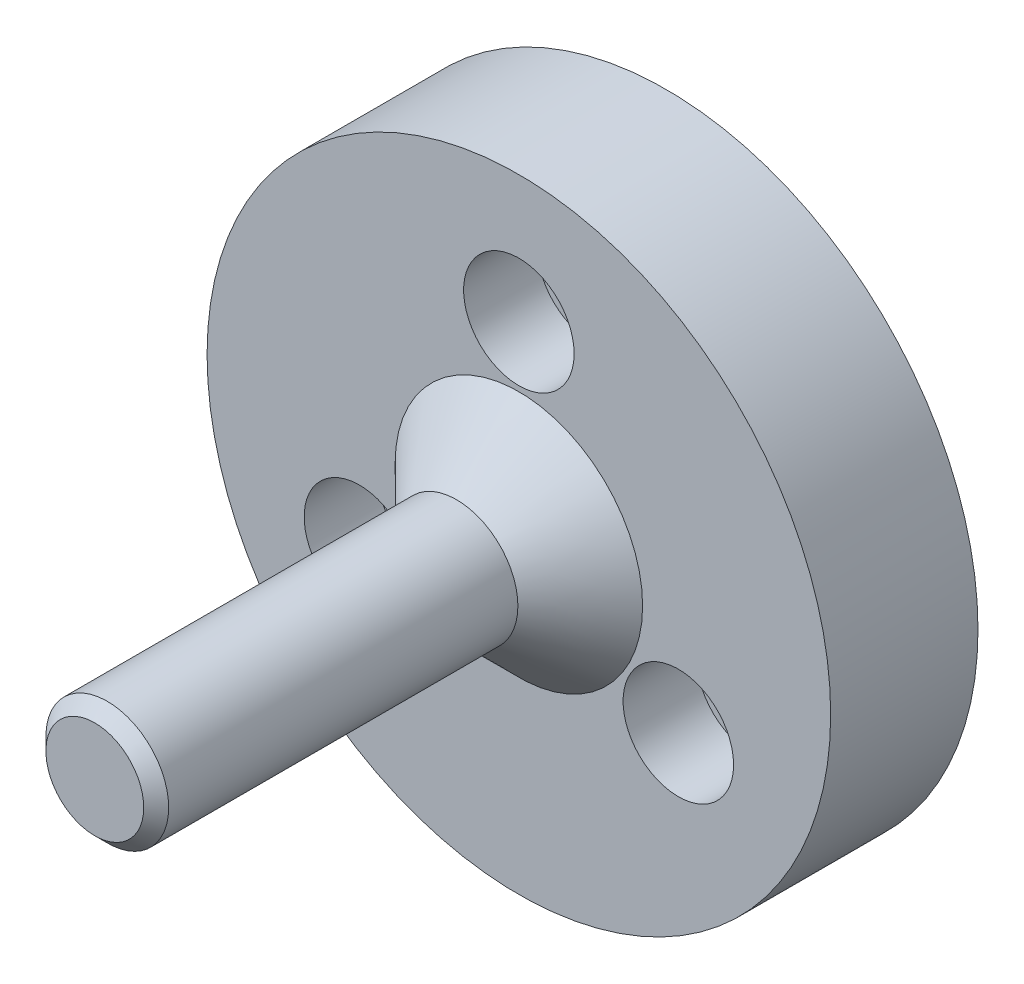
ISO-10303-21;
HEADER;
FILE_DESCRIPTION(('STEP AP214'),'2;1');
FILE_NAME('part.step','',(''),(''),'','','');
FILE_SCHEMA(('AUTOMOTIVE_DESIGN { 1 0 10303 214 1 1 1 1 }'));
ENDSEC;
DATA;
#1=APPLICATION_CONTEXT('core data for automotive mechanical design processes');
#2=APPLICATION_PROTOCOL_DEFINITION('international standard','automotive_design',2000,#1);
#3=PRODUCT_CONTEXT('',#1,'mechanical');
#4=PRODUCT('Part','Part','',(#3));
#5=PRODUCT_RELATED_PRODUCT_CATEGORY('part','',(#4));
#6=PRODUCT_DEFINITION_FORMATION('','',#4);
#7=PRODUCT_DEFINITION_CONTEXT('part definition',#1,'design');
#8=PRODUCT_DEFINITION('design','',#6,#7);
#9=PRODUCT_DEFINITION_SHAPE('','',#8);
#10=(LENGTH_UNIT() NAMED_UNIT(*) SI_UNIT(.MILLI.,.METRE.));
#11=(NAMED_UNIT(*) PLANE_ANGLE_UNIT() SI_UNIT($,.RADIAN.));
#12=(NAMED_UNIT(*) SI_UNIT($,.STERADIAN.) SOLID_ANGLE_UNIT());
#13=UNCERTAINTY_MEASURE_WITH_UNIT(LENGTH_MEASURE(1.E-05),#10,'distance_accuracy_value','');
#14=(GEOMETRIC_REPRESENTATION_CONTEXT(3) GLOBAL_UNCERTAINTY_ASSIGNED_CONTEXT((#13)) GLOBAL_UNIT_ASSIGNED_CONTEXT((#10,
#11,#12)) REPRESENTATION_CONTEXT('',''));
#15=CARTESIAN_POINT('',(0.,0.,0.));
#16=DIRECTION('',(0.,0.,1.));
#17=DIRECTION('',(1.,0.,0.));
#18=AXIS2_PLACEMENT_3D('',#15,#16,#17);
#19=CARTESIAN_POINT('',(6.49519052838377,-3.74999999999972,0.));
#20=DIRECTION('',(0.,0.,1.));
#21=DIRECTION('',(1.,0.,0.));
#22=AXIS2_PLACEMENT_3D('',#19,#20,#21);
#23=CYLINDRICAL_SURFACE('',#22,1.45);
#24=CARTESIAN_POINT('',(6.49519052838377,-3.74999999999972,2.54));
#25=DIRECTION('',(0.,0.,-1.));
#26=DIRECTION('',(-1.,0.,0.));
#27=AXIS2_PLACEMENT_3D('',#24,#25,#26);
#28=CIRCLE('',#27,1.45);
#29=CARTESIAN_POINT('',(5.04873569964322,-3.85133325423132,2.54));
#30=VERTEX_POINT('',#29);
#31=CARTESIAN_POINT('',(5.85972028642604,-2.44666674576802,2.54));
#32=VERTEX_POINT('',#31);
#33=EDGE_CURVE('E140',#30,#32,#28,.T.);
#34=ORIENTED_EDGE('',*,*,#33,.T.);
#35=DIRECTION('',(0.,0.,1.));
#36=VECTOR('',#35,1.);
#37=CARTESIAN_POINT('',(5.85972028642604,-2.44666674576802,3.));
#38=LINE('',#37,#36);
#39=CARTESIAN_POINT('',(5.85972028642604,-2.44666674576802,0.));
#40=VERTEX_POINT('',#39);
#41=EDGE_CURVE('E218',#40,#32,#38,.T.);
#42=ORIENTED_EDGE('',*,*,#41,.F.);
#43=CARTESIAN_POINT('',(6.49519052838377,-3.74999999999972,0.));
#44=DIRECTION('',(0.,0.,1.));
#45=DIRECTION('',(1.,0.,0.));
#46=AXIS2_PLACEMENT_3D('',#43,#44,#45);
#47=CIRCLE('',#46,1.45);
#48=CARTESIAN_POINT('',(5.04873569964323,-3.85133325423132,0.));
#49=VERTEX_POINT('',#48);
#50=EDGE_CURVE('E103',#49,#40,#47,.T.);
#51=ORIENTED_EDGE('',*,*,#50,.F.);
#52=DIRECTION('',(0.,0.,1.));
#53=VECTOR('',#52,1.);
#54=CARTESIAN_POINT('',(5.04873569964323,-3.85133325423132,3.));
#55=LINE('',#54,#53);
#56=EDGE_CURVE('E57',#30,#49,#55,.F.);
#57=ORIENTED_EDGE('',*,*,#56,.F.);
#58=EDGE_LOOP('',(#34,#42,#51,#57));
#59=FACE_BOUND('',#58,.T.);
#60=CARTESIAN_POINT('',(6.49519052838377,-3.74999999999972,3.));
#61=DIRECTION('',(0.,0.,1.));
#62=DIRECTION('',(1.,0.,0.));
#63=AXIS2_PLACEMENT_3D('',#60,#61,#62);
#64=CIRCLE('',#63,1.45);
#65=CARTESIAN_POINT('',(7.94519052838377,-3.74999999999972,3.));
#66=VERTEX_POINT('',#65);
#67=EDGE_CURVE('E153',#66,#66,#64,.F.);
#68=ORIENTED_EDGE('',*,*,#67,.F.);
#69=EDGE_LOOP('',(#68));
#70=FACE_BOUND('',#69,.T.);
#71=ADVANCED_FACE('F34',(#59,#70),#23,.F.);
#72=CARTESIAN_POINT('',(-6.49519052838281,-3.75000000000028,0.));
#73=DIRECTION('',(0.,0.,1.));
#74=DIRECTION('',(1.,0.,0.));
#75=AXIS2_PLACEMENT_3D('',#72,#73,#74);
#76=CYLINDRICAL_SURFACE('',#75,1.45);
#77=CARTESIAN_POINT('',(-6.49519052838281,-3.75000000000028,2.54));
#78=DIRECTION('',(0.,0.,-1.));
#79=DIRECTION('',(-1.,0.,0.));
#80=AXIS2_PLACEMENT_3D('',#77,#78,#79);
#81=CIRCLE('',#80,1.45);
#82=CARTESIAN_POINT('',(-5.859720286426,-2.44666674576814,2.54));
#83=VERTEX_POINT('',#82);
#84=CARTESIAN_POINT('',(-5.04873569964231,-3.85133325423252,2.54));
#85=VERTEX_POINT('',#84);
#86=EDGE_CURVE('E142',#83,#85,#81,.T.);
#87=ORIENTED_EDGE('',*,*,#86,.T.);
#88=DIRECTION('',(0.,0.,1.));
#89=VECTOR('',#88,1.);
#90=CARTESIAN_POINT('',(-5.04873569964231,-3.85133325423252,3.));
#91=LINE('',#90,#89);
#92=CARTESIAN_POINT('',(-5.04873569964231,-3.85133325423252,0.));
#93=VERTEX_POINT('',#92);
#94=EDGE_CURVE('E89',#93,#85,#91,.T.);
#95=ORIENTED_EDGE('',*,*,#94,.F.);
#96=CARTESIAN_POINT('',(-6.49519052838281,-3.75000000000028,0.));
#97=DIRECTION('',(0.,0.,1.));
#98=DIRECTION('',(1.,0.,0.));
#99=AXIS2_PLACEMENT_3D('',#96,#97,#98);
#100=CIRCLE('',#99,1.45);
#101=CARTESIAN_POINT('',(-5.859720286426,-2.44666674576814,0.));
#102=VERTEX_POINT('',#101);
#103=EDGE_CURVE('E85',#102,#93,#100,.T.);
#104=ORIENTED_EDGE('',*,*,#103,.F.);
#105=DIRECTION('',(0.,0.,1.));
#106=VECTOR('',#105,1.);
#107=CARTESIAN_POINT('',(-5.859720286426,-2.44666674576814,3.));
#108=LINE('',#107,#106);
#109=EDGE_CURVE('E49',#83,#102,#108,.F.);
#110=ORIENTED_EDGE('',*,*,#109,.F.);
#111=EDGE_LOOP('',(#87,#95,#104,#110));
#112=FACE_BOUND('',#111,.T.);
#113=CARTESIAN_POINT('',(-6.49519052838281,-3.75000000000028,3.));
#114=DIRECTION('',(0.,0.,1.));
#115=DIRECTION('',(1.,0.,0.));
#116=AXIS2_PLACEMENT_3D('',#113,#114,#115);
#117=CIRCLE('',#116,1.45);
#118=CARTESIAN_POINT('',(-5.04519052838281,-3.75000000000028,3.));
#119=VERTEX_POINT('',#118);
#120=EDGE_CURVE('E148',#119,#119,#117,.F.);
#121=ORIENTED_EDGE('',*,*,#120,.F.);
#122=EDGE_LOOP('',(#121));
#123=FACE_BOUND('',#122,.T.);
#124=ADVANCED_FACE('F86',(#112,#123),#76,.F.);
#125=CARTESIAN_POINT('',(0.,7.5,0.));
#126=DIRECTION('',(0.,0.,1.));
#127=DIRECTION('',(1.,0.,0.));
#128=AXIS2_PLACEMENT_3D('',#125,#126,#127);
#129=CYLINDRICAL_SURFACE('',#128,1.45);
#130=CARTESIAN_POINT('',(0.,7.5,2.54));
#131=DIRECTION('',(0.,0.,-1.));
#132=DIRECTION('',(-1.,0.,0.));
#133=AXIS2_PLACEMENT_3D('',#130,#131,#132);
#134=CIRCLE('',#133,1.45);
#135=CARTESIAN_POINT('',(0.810984586783252,6.298,2.54));
#136=VERTEX_POINT('',#135);
#137=CARTESIAN_POINT('',(-0.810984586783252,6.298,2.54));
#138=VERTEX_POINT('',#137);
#139=EDGE_CURVE('E137',#136,#138,#134,.T.);
#140=ORIENTED_EDGE('',*,*,#139,.T.);
#141=DIRECTION('',(0.,0.,1.));
#142=VECTOR('',#141,1.);
#143=CARTESIAN_POINT('',(-0.810984586783251,6.298,3.));
#144=LINE('',#143,#142);
#145=CARTESIAN_POINT('',(-0.810984586783251,6.298,0.));
#146=VERTEX_POINT('',#145);
#147=EDGE_CURVE('E115',#146,#138,#144,.T.);
#148=ORIENTED_EDGE('',*,*,#147,.F.);
#149=CARTESIAN_POINT('',(0.,7.5,0.));
#150=DIRECTION('',(0.,0.,1.));
#151=DIRECTION('',(1.,0.,0.));
#152=AXIS2_PLACEMENT_3D('',#149,#150,#151);
#153=CIRCLE('',#152,1.45);
#154=CARTESIAN_POINT('',(0.810984586783251,6.298,0.));
#155=VERTEX_POINT('',#154);
#156=EDGE_CURVE('E109',#155,#146,#153,.T.);
#157=ORIENTED_EDGE('',*,*,#156,.F.);
#158=DIRECTION('',(0.,0.,1.));
#159=VECTOR('',#158,1.);
#160=CARTESIAN_POINT('',(0.810984586783251,6.298,3.));
#161=LINE('',#160,#159);
#162=EDGE_CURVE('E111',#136,#155,#161,.F.);
#163=ORIENTED_EDGE('',*,*,#162,.F.);
#164=EDGE_LOOP('',(#140,#148,#157,#163));
#165=FACE_BOUND('',#164,.T.);
#166=CARTESIAN_POINT('',(0.,7.5,3.));
#167=DIRECTION('',(0.,0.,1.));
#168=DIRECTION('',(1.,0.,0.));
#169=AXIS2_PLACEMENT_3D('',#166,#167,#168);
#170=CIRCLE('',#169,1.45);
#171=CARTESIAN_POINT('',(1.45,7.5,3.));
#172=VERTEX_POINT('',#171);
#173=EDGE_CURVE('E94',#172,#172,#170,.F.);
#174=ORIENTED_EDGE('',*,*,#173,.F.);
#175=EDGE_LOOP('',(#174));
#176=FACE_BOUND('',#175,.T.);
#177=ADVANCED_FACE('F182',(#165,#176),#129,.F.);
#178=CARTESIAN_POINT('',(0.,0.,2.54));
#179=DIRECTION('',(0.,0.,-1.));
#180=DIRECTION('',(-1.,0.,0.));
#181=AXIS2_PLACEMENT_3D('',#178,#179,#180);
#182=CYLINDRICAL_SURFACE('',#181,6.35);
#183=CARTESIAN_POINT('',(0.,0.,2.54));
#184=DIRECTION('',(0.,0.,-1.));
#185=DIRECTION('',(-1.,0.,0.));
#186=AXIS2_PLACEMENT_3D('',#183,#184,#185);
#187=CIRCLE('',#186,6.35);
#188=EDGE_CURVE('E102',#83,#138,#187,.T.);
#189=ORIENTED_EDGE('',*,*,#188,.F.);
#190=ORIENTED_EDGE('',*,*,#109,.T.);
#191=CARTESIAN_POINT('',(0.,0.,0.));
#192=DIRECTION('',(0.,0.,-1.));
#193=DIRECTION('',(-1.,0.,0.));
#194=AXIS2_PLACEMENT_3D('',#191,#192,#193);
#195=CIRCLE('',#194,6.35);
#196=EDGE_CURVE('E100',#102,#146,#195,.T.);
#197=ORIENTED_EDGE('',*,*,#196,.T.);
#198=ORIENTED_EDGE('',*,*,#147,.T.);
#199=EDGE_LOOP('',(#189,#190,#197,#198));
#200=FACE_BOUND('',#199,.T.);
#201=ADVANCED_FACE('F98',(#200),#182,.F.);
#202=EDGE_CURVE('E110',#49,#93,#195,.T.);
#203=ORIENTED_EDGE('',*,*,#202,.T.);
#204=ORIENTED_EDGE('',*,*,#94,.T.);
#205=EDGE_CURVE('E122',#30,#85,#187,.T.);
#206=ORIENTED_EDGE('',*,*,#205,.F.);
#207=ORIENTED_EDGE('',*,*,#56,.T.);
#208=EDGE_LOOP('',(#203,#204,#206,#207));
#209=FACE_BOUND('',#208,.T.);
#210=ADVANCED_FACE('F197',(#209),#182,.F.);
#211=CARTESIAN_POINT('',(0.,0.,6.));
#212=DIRECTION('',(0.,0.,-1.));
#213=DIRECTION('',(-1.,0.,0.));
#214=AXIS2_PLACEMENT_3D('',#211,#212,#213);
#215=CYLINDRICAL_SURFACE('',#214,12.7);
#216=CARTESIAN_POINT('',(0.,0.,6.));
#217=DIRECTION('',(0.,0.,1.));
#218=DIRECTION('',(1.,0.,0.));
#219=AXIS2_PLACEMENT_3D('',#216,#217,#218);
#220=CIRCLE('',#219,12.7);
#221=CARTESIAN_POINT('',(12.7,0.,6.));
#222=VERTEX_POINT('',#221);
#223=EDGE_CURVE('E132',#222,#222,#220,.T.);
#224=ORIENTED_EDGE('',*,*,#223,.F.);
#225=EDGE_LOOP('',(#224));
#226=FACE_BOUND('',#225,.T.);
#227=CARTESIAN_POINT('',(0.,0.,0.));
#228=DIRECTION('',(0.,0.,1.));
#229=DIRECTION('',(1.,0.,0.));
#230=AXIS2_PLACEMENT_3D('',#227,#228,#229);
#231=CIRCLE('',#230,12.7);
#232=CARTESIAN_POINT('',(12.7,0.,0.));
#233=VERTEX_POINT('',#232);
#234=EDGE_CURVE('E129',#233,#233,#231,.T.);
#235=ORIENTED_EDGE('',*,*,#234,.T.);
#236=EDGE_LOOP('',(#235));
#237=FACE_BOUND('',#236,.T.);
#238=ADVANCED_FACE('F201',(#226,#237),#215,.T.);
#239=CARTESIAN_POINT('',(0.,0.,6.));
#240=DIRECTION('',(0.,0.,1.));
#241=DIRECTION('',(1.,0.,0.));
#242=AXIS2_PLACEMENT_3D('',#239,#240,#241);
#243=PLANE('',#242);
#244=CARTESIAN_POINT('',(0.,0.,6.));
#245=DIRECTION('',(0.,0.,1.));
#246=DIRECTION('',(1.,0.,0.));
#247=AXIS2_PLACEMENT_3D('',#244,#245,#246);
#248=CIRCLE('',#247,5.04);
#249=CARTESIAN_POINT('',(5.04,0.,6.));
#250=VERTEX_POINT('',#249);
#251=EDGE_CURVE('E11',#250,#250,#248,.F.);
#252=ORIENTED_EDGE('',*,*,#251,.T.);
#253=EDGE_LOOP('',(#252));
#254=FACE_BOUND('',#253,.T.);
#255=CARTESIAN_POINT('',(6.49519052838377,-3.74999999999972,6.));
#256=DIRECTION('',(0.,0.,1.));
#257=DIRECTION('',(1.,0.,0.));
#258=AXIS2_PLACEMENT_3D('',#255,#256,#257);
#259=CIRCLE('',#258,2.25);
#260=CARTESIAN_POINT('',(8.74519052838377,-3.74999999999972,6.));
#261=VERTEX_POINT('',#260);
#262=EDGE_CURVE('E374',#261,#261,#259,.T.);
#263=ORIENTED_EDGE('',*,*,#262,.F.);
#264=EDGE_LOOP('',(#263));
#265=FACE_BOUND('',#264,.T.);
#266=CARTESIAN_POINT('',(-6.49519052838281,-3.75000000000028,6.));
#267=DIRECTION('',(0.,0.,1.));
#268=DIRECTION('',(1.,0.,0.));
#269=AXIS2_PLACEMENT_3D('',#266,#267,#268);
#270=CIRCLE('',#269,2.25);
#271=CARTESIAN_POINT('',(-4.24519052838281,-3.75000000000028,6.));
#272=VERTEX_POINT('',#271);
#273=EDGE_CURVE('E156',#272,#272,#270,.T.);
#274=ORIENTED_EDGE('',*,*,#273,.F.);
#275=EDGE_LOOP('',(#274));
#276=FACE_BOUND('',#275,.T.);
#277=CARTESIAN_POINT('',(0.,7.5,6.));
#278=DIRECTION('',(0.,0.,1.));
#279=DIRECTION('',(1.,0.,0.));
#280=AXIS2_PLACEMENT_3D('',#277,#278,#279);
#281=CIRCLE('',#280,2.25);
#282=CARTESIAN_POINT('',(2.25,7.5,6.));
#283=VERTEX_POINT('',#282);
#284=EDGE_CURVE('E151',#283,#283,#281,.T.);
#285=ORIENTED_EDGE('',*,*,#284,.F.);
#286=EDGE_LOOP('',(#285));
#287=FACE_BOUND('',#286,.T.);
#288=ORIENTED_EDGE('',*,*,#223,.T.);
#289=EDGE_LOOP('',(#288));
#290=FACE_BOUND('',#289,.T.);
#291=ADVANCED_FACE('F198',(#254,#265,#276,#287,#290),#243,.T.);
#292=CARTESIAN_POINT('',(0.,0.,0.));
#293=DIRECTION('',(0.,0.,1.));
#294=DIRECTION('',(1.,0.,0.));
#295=AXIS2_PLACEMENT_3D('',#292,#293,#294);
#296=PLANE('',#295);
#297=ORIENTED_EDGE('',*,*,#196,.F.);
#298=ORIENTED_EDGE('',*,*,#103,.T.);
#299=ORIENTED_EDGE('',*,*,#202,.F.);
#300=ORIENTED_EDGE('',*,*,#50,.T.);
#301=EDGE_CURVE('E113',#155,#40,#195,.T.);
#302=ORIENTED_EDGE('',*,*,#301,.F.);
#303=ORIENTED_EDGE('',*,*,#156,.T.);
#304=EDGE_LOOP('',(#297,#298,#299,#300,#302,#303));
#305=FACE_BOUND('',#304,.T.);
#306=ORIENTED_EDGE('',*,*,#234,.F.);
#307=EDGE_LOOP('',(#306));
#308=FACE_BOUND('',#307,.T.);
#309=ADVANCED_FACE('F106',(#305,#308),#296,.F.);
#310=ORIENTED_EDGE('',*,*,#301,.T.);
#311=ORIENTED_EDGE('',*,*,#41,.T.);
#312=EDGE_CURVE('E123',#136,#32,#187,.T.);
#313=ORIENTED_EDGE('',*,*,#312,.F.);
#314=ORIENTED_EDGE('',*,*,#162,.T.);
#315=EDGE_LOOP('',(#310,#311,#313,#314));
#316=FACE_BOUND('',#315,.T.);
#317=ADVANCED_FACE('F194',(#316),#182,.F.);
#318=CARTESIAN_POINT('',(0.,0.,2.54));
#319=DIRECTION('',(0.,0.,-1.));
#320=DIRECTION('',(-1.,0.,0.));
#321=AXIS2_PLACEMENT_3D('',#318,#319,#320);
#322=PLANE('',#321);
#323=ORIENTED_EDGE('',*,*,#86,.F.);
#324=ORIENTED_EDGE('',*,*,#188,.T.);
#325=ORIENTED_EDGE('',*,*,#139,.F.);
#326=ORIENTED_EDGE('',*,*,#312,.T.);
#327=ORIENTED_EDGE('',*,*,#33,.F.);
#328=ORIENTED_EDGE('',*,*,#205,.T.);
#329=EDGE_LOOP('',(#323,#324,#325,#326,#327,#328));
#330=FACE_BOUND('',#329,.T.);
#331=ADVANCED_FACE('F190',(#330),#322,.T.);
#332=CARTESIAN_POINT('',(0.,7.5,3.));
#333=DIRECTION('',(0.,0.,1.));
#334=DIRECTION('',(1.,0.,0.));
#335=AXIS2_PLACEMENT_3D('',#332,#333,#334);
#336=PLANE('',#335);
#337=CARTESIAN_POINT('',(0.,7.5,3.));
#338=DIRECTION('',(0.,0.,1.));
#339=DIRECTION('',(1.,0.,0.));
#340=AXIS2_PLACEMENT_3D('',#337,#338,#339);
#341=CIRCLE('',#340,2.25);
#342=CARTESIAN_POINT('',(2.25,7.5,3.));
#343=VERTEX_POINT('',#342);
#344=EDGE_CURVE('E147',#343,#343,#341,.T.);
#345=ORIENTED_EDGE('',*,*,#344,.T.);
#346=EDGE_LOOP('',(#345));
#347=FACE_BOUND('',#346,.T.);
#348=ORIENTED_EDGE('',*,*,#173,.T.);
#349=EDGE_LOOP('',(#348));
#350=FACE_BOUND('',#349,.T.);
#351=ADVANCED_FACE('F193',(#347,#350),#336,.T.);
#352=CARTESIAN_POINT('',(0.,7.5,3.));
#353=DIRECTION('',(0.,0.,1.));
#354=DIRECTION('',(1.,0.,0.));
#355=AXIS2_PLACEMENT_3D('',#352,#353,#354);
#356=CYLINDRICAL_SURFACE('',#355,2.25);
#357=ORIENTED_EDGE('',*,*,#344,.F.);
#358=EDGE_LOOP('',(#357));
#359=FACE_BOUND('',#358,.T.);
#360=ORIENTED_EDGE('',*,*,#284,.T.);
#361=EDGE_LOOP('',(#360));
#362=FACE_BOUND('',#361,.T.);
#363=ADVANCED_FACE('F229',(#359,#362),#356,.F.);
#364=CARTESIAN_POINT('',(-6.49519052838281,-3.75000000000028,3.));
#365=DIRECTION('',(0.,0.,1.));
#366=DIRECTION('',(1.,0.,0.));
#367=AXIS2_PLACEMENT_3D('',#364,#365,#366);
#368=PLANE('',#367);
#369=CARTESIAN_POINT('',(-6.49519052838281,-3.75000000000028,3.));
#370=DIRECTION('',(0.,0.,1.));
#371=DIRECTION('',(1.,0.,0.));
#372=AXIS2_PLACEMENT_3D('',#369,#370,#371);
#373=CIRCLE('',#372,2.25);
#374=CARTESIAN_POINT('',(-4.24519052838281,-3.75000000000028,3.));
#375=VERTEX_POINT('',#374);
#376=EDGE_CURVE('E152',#375,#375,#373,.T.);
#377=ORIENTED_EDGE('',*,*,#376,.T.);
#378=EDGE_LOOP('',(#377));
#379=FACE_BOUND('',#378,.T.);
#380=ORIENTED_EDGE('',*,*,#120,.T.);
#381=EDGE_LOOP('',(#380));
#382=FACE_BOUND('',#381,.T.);
#383=ADVANCED_FACE('F235',(#379,#382),#368,.T.);
#384=CARTESIAN_POINT('',(-6.49519052838281,-3.75000000000028,3.));
#385=DIRECTION('',(0.,0.,1.));
#386=DIRECTION('',(1.,0.,0.));
#387=AXIS2_PLACEMENT_3D('',#384,#385,#386);
#388=CYLINDRICAL_SURFACE('',#387,2.25);
#389=ORIENTED_EDGE('',*,*,#376,.F.);
#390=EDGE_LOOP('',(#389));
#391=FACE_BOUND('',#390,.T.);
#392=ORIENTED_EDGE('',*,*,#273,.T.);
#393=EDGE_LOOP('',(#392));
#394=FACE_BOUND('',#393,.T.);
#395=ADVANCED_FACE('F239',(#391,#394),#388,.F.);
#396=CARTESIAN_POINT('',(6.49519052838377,-3.74999999999972,3.));
#397=DIRECTION('',(0.,0.,1.));
#398=DIRECTION('',(1.,0.,0.));
#399=AXIS2_PLACEMENT_3D('',#396,#397,#398);
#400=PLANE('',#399);
#401=CARTESIAN_POINT('',(6.49519052838377,-3.74999999999972,3.));
#402=DIRECTION('',(0.,0.,1.));
#403=DIRECTION('',(1.,0.,0.));
#404=AXIS2_PLACEMENT_3D('',#401,#402,#403);
#405=CIRCLE('',#404,2.25);
#406=CARTESIAN_POINT('',(8.74519052838377,-3.74999999999972,3.));
#407=VERTEX_POINT('',#406);
#408=EDGE_CURVE('E157',#407,#407,#405,.T.);
#409=ORIENTED_EDGE('',*,*,#408,.T.);
#410=EDGE_LOOP('',(#409));
#411=FACE_BOUND('',#410,.T.);
#412=ORIENTED_EDGE('',*,*,#67,.T.);
#413=EDGE_LOOP('',(#412));
#414=FACE_BOUND('',#413,.T.);
#415=ADVANCED_FACE('F242',(#411,#414),#400,.T.);
#416=CARTESIAN_POINT('',(6.49519052838377,-3.74999999999972,3.));
#417=DIRECTION('',(0.,0.,1.));
#418=DIRECTION('',(1.,0.,0.));
#419=AXIS2_PLACEMENT_3D('',#416,#417,#418);
#420=CYLINDRICAL_SURFACE('',#419,2.25);
#421=ORIENTED_EDGE('',*,*,#408,.F.);
#422=EDGE_LOOP('',(#421));
#423=FACE_BOUND('',#422,.T.);
#424=ORIENTED_EDGE('',*,*,#262,.T.);
#425=EDGE_LOOP('',(#424));
#426=FACE_BOUND('',#425,.T.);
#427=ADVANCED_FACE('F247',(#423,#426),#420,.F.);
#428=CARTESIAN_POINT('',(0.,0.,23.272));
#429=DIRECTION('',(0.,0.,-1.));
#430=DIRECTION('',(-1.,0.,0.));
#431=AXIS2_PLACEMENT_3D('',#428,#429,#430);
#432=CYLINDRICAL_SURFACE('',#431,2.5);
#433=CARTESIAN_POINT('',(0.,0.,8.54000000000002));
#434=DIRECTION('',(0.,0.,1.));
#435=DIRECTION('',(1.,0.,0.));
#436=AXIS2_PLACEMENT_3D('',#433,#434,#435);
#437=CIRCLE('',#436,2.5);
#438=CARTESIAN_POINT('',(2.5,0.,8.54000000000002));
#439=VERTEX_POINT('',#438);
#440=EDGE_CURVE('E42',#439,#439,#437,.T.);
#441=ORIENTED_EDGE('',*,*,#440,.T.);
#442=EDGE_LOOP('',(#441));
#443=FACE_BOUND('',#442,.T.);
#444=CARTESIAN_POINT('',(0.,0.,22.764));
#445=DIRECTION('',(0.,0.,1.));
#446=DIRECTION('',(1.,0.,0.));
#447=AXIS2_PLACEMENT_3D('',#444,#445,#446);
#448=CIRCLE('',#447,2.5);
#449=CARTESIAN_POINT('',(2.5,0.,22.764));
#450=VERTEX_POINT('',#449);
#451=EDGE_CURVE('E160',#450,#450,#448,.F.);
#452=ORIENTED_EDGE('',*,*,#451,.T.);
#453=EDGE_LOOP('',(#452));
#454=FACE_BOUND('',#453,.T.);
#455=ADVANCED_FACE('F165',(#443,#454),#432,.T.);
#456=CARTESIAN_POINT('',(0.,0.,23.272));
#457=DIRECTION('',(0.,0.,1.));
#458=DIRECTION('',(1.,0.,0.));
#459=AXIS2_PLACEMENT_3D('',#456,#457,#458);
#460=PLANE('',#459);
#461=CARTESIAN_POINT('',(0.,0.,23.272));
#462=DIRECTION('',(0.,0.,1.));
#463=DIRECTION('',(1.,0.,0.));
#464=AXIS2_PLACEMENT_3D('',#461,#462,#463);
#465=CIRCLE('',#464,1.99200000000001);
#466=CARTESIAN_POINT('',(1.99200000000001,0.,23.272));
#467=VERTEX_POINT('',#466);
#468=EDGE_CURVE('E144',#467,#467,#465,.T.);
#469=ORIENTED_EDGE('',*,*,#468,.T.);
#470=EDGE_LOOP('',(#469));
#471=FACE_BOUND('',#470,.T.);
#472=ADVANCED_FACE('F174',(#471),#460,.T.);
#473=CARTESIAN_POINT('',(0.,0.,23.272));
#474=DIRECTION('',(0.,0.,-1.));
#475=DIRECTION('',(-1.,0.,0.));
#476=AXIS2_PLACEMENT_3D('',#473,#474,#475);
#477=CONICAL_SURFACE('',#476,1.99200000000001,0.785398163397443);
#478=ORIENTED_EDGE('',*,*,#451,.F.);
#479=EDGE_LOOP('',(#478));
#480=FACE_BOUND('',#479,.T.);
#481=ORIENTED_EDGE('',*,*,#468,.F.);
#482=EDGE_LOOP('',(#481));
#483=FACE_BOUND('',#482,.T.);
#484=ADVANCED_FACE('F169',(#480,#483),#477,.T.);
#485=CARTESIAN_POINT('',(0.,0.,8.54000000000002));
#486=DIRECTION('',(0.,0.,-1.));
#487=DIRECTION('',(-1.,0.,0.));
#488=AXIS2_PLACEMENT_3D('',#485,#486,#487);
#489=CONICAL_SURFACE('',#488,2.5,0.785398163397444);
#490=ORIENTED_EDGE('',*,*,#251,.F.);
#491=EDGE_LOOP('',(#490));
#492=FACE_BOUND('',#491,.T.);
#493=ORIENTED_EDGE('',*,*,#440,.F.);
#494=EDGE_LOOP('',(#493));
#495=FACE_BOUND('',#494,.T.);
#496=ADVANCED_FACE('F36',(#492,#495),#489,.T.);
#497=CLOSED_SHELL('',(#71,#124,#177,#201,#210,#238,#291,#309,#317,#331,#351,#363,#383,#395,#415,
#427,#455,#472,#484,#496));
#498=MANIFOLD_SOLID_BREP('B2',#497);
#499=ADVANCED_BREP_SHAPE_REPRESENTATION('',(#18,#498),#14);
#500=SHAPE_DEFINITION_REPRESENTATION(#9,#499);
ENDSEC;
END-ISO-10303-21;
